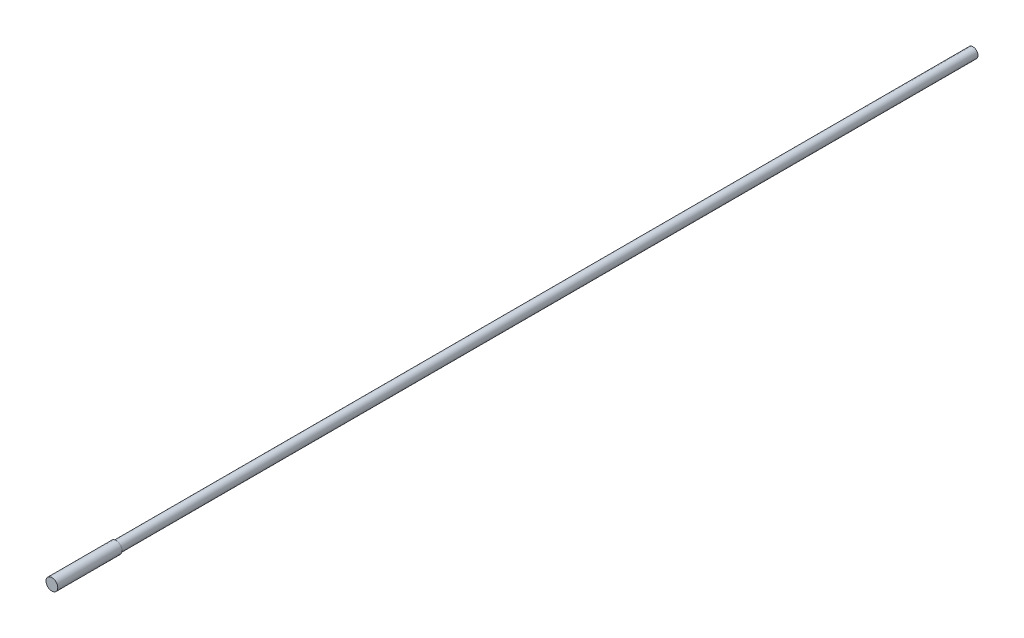
ISO-10303-21;
HEADER;
FILE_DESCRIPTION(('STEP AP214'),'2;1');
FILE_NAME('part.step','',(''),(''),'','','');
FILE_SCHEMA(('AUTOMOTIVE_DESIGN { 1 0 10303 214 1 1 1 1 }'));
ENDSEC;
DATA;
#1=APPLICATION_CONTEXT('core data for automotive mechanical design processes');
#2=APPLICATION_PROTOCOL_DEFINITION('international standard','automotive_design',2000,#1);
#3=PRODUCT_CONTEXT('',#1,'mechanical');
#4=PRODUCT('Part','Part','',(#3));
#5=PRODUCT_RELATED_PRODUCT_CATEGORY('part','',(#4));
#6=PRODUCT_DEFINITION_FORMATION('','',#4);
#7=PRODUCT_DEFINITION_CONTEXT('part definition',#1,'design');
#8=PRODUCT_DEFINITION('design','',#6,#7);
#9=PRODUCT_DEFINITION_SHAPE('','',#8);
#10=(LENGTH_UNIT() NAMED_UNIT(*) SI_UNIT(.MILLI.,.METRE.));
#11=(NAMED_UNIT(*) PLANE_ANGLE_UNIT() SI_UNIT($,.RADIAN.));
#12=(NAMED_UNIT(*) SI_UNIT($,.STERADIAN.) SOLID_ANGLE_UNIT());
#13=UNCERTAINTY_MEASURE_WITH_UNIT(LENGTH_MEASURE(1.E-05),#10,'distance_accuracy_value','');
#14=(GEOMETRIC_REPRESENTATION_CONTEXT(3) GLOBAL_UNCERTAINTY_ASSIGNED_CONTEXT((#13)) GLOBAL_UNIT_ASSIGNED_CONTEXT((#10,
#11,#12)) REPRESENTATION_CONTEXT('',''));
#15=CARTESIAN_POINT('',(0.,0.,0.));
#16=DIRECTION('',(0.,0.,1.));
#17=DIRECTION('',(1.,0.,0.));
#18=AXIS2_PLACEMENT_3D('',#15,#16,#17);
#19=CARTESIAN_POINT('',(0.,0.,0.));
#20=DIRECTION('',(0.,0.,1.));
#21=DIRECTION('',(1.,0.,0.));
#22=AXIS2_PLACEMENT_3D('',#19,#20,#21);
#23=PLANE('',#22);
#24=CARTESIAN_POINT('',(0.,0.,0.));
#25=DIRECTION('',(0.,0.,1.));
#26=DIRECTION('',(1.,0.,0.));
#27=AXIS2_PLACEMENT_3D('',#24,#25,#26);
#28=CIRCLE('',#27,2.3495);
#29=CARTESIAN_POINT('',(-2.3495,0.,0.));
#30=VERTEX_POINT('',#29);
#31=EDGE_CURVE('E35',#30,#30,#28,.T.);
#32=ORIENTED_EDGE('',*,*,#31,.F.);
#33=EDGE_LOOP('',(#32));
#34=FACE_BOUND('',#33,.T.);
#35=CARTESIAN_POINT('',(0.,0.,0.));
#36=DIRECTION('',(0.,0.,1.));
#37=DIRECTION('',(1.,0.,0.));
#38=AXIS2_PLACEMENT_3D('',#35,#36,#37);
#39=CIRCLE('',#38,1.5625);
#40=CARTESIAN_POINT('',(-1.5625,0.,0.));
#41=VERTEX_POINT('',#40);
#42=EDGE_CURVE('E42',#41,#41,#39,.T.);
#43=ORIENTED_EDGE('',*,*,#42,.T.);
#44=EDGE_LOOP('',(#43));
#45=FACE_BOUND('',#44,.T.);
#46=ADVANCED_FACE('F31',(#34,#45),#23,.F.);
#47=CARTESIAN_POINT('',(0.,0.,400.0000001));
#48=DIRECTION('',(0.,0.,-1.));
#49=DIRECTION('',(-1.,0.,0.));
#50=AXIS2_PLACEMENT_3D('',#47,#48,#49);
#51=CYLINDRICAL_SURFACE('',#50,2.3495);
#52=CARTESIAN_POINT('',(0.,0.,400.0000001));
#53=DIRECTION('',(0.,0.,1.));
#54=DIRECTION('',(1.,0.,0.));
#55=AXIS2_PLACEMENT_3D('',#52,#53,#54);
#56=CIRCLE('',#55,2.3495);
#57=CARTESIAN_POINT('',(-2.3495,0.,400.0000001));
#58=VERTEX_POINT('',#57);
#59=EDGE_CURVE('E10',#58,#58,#56,.T.);
#60=CARTESIAN_POINT('',(-2.3495,0.,400.0000001));
#61=CARTESIAN_POINT('',(-2.3495,0.,395.833333432292));
#62=CARTESIAN_POINT('',(-2.3495,0.,391.666666764583));
#63=CARTESIAN_POINT('',(-2.3495,0.,383.333333429167));
#64=CARTESIAN_POINT('',(-2.3495,0.,379.166666761458));
#65=CARTESIAN_POINT('',(-2.3495,0.,370.833333426042));
#66=CARTESIAN_POINT('',(-2.3495,0.,366.666666758333));
#67=CARTESIAN_POINT('',(-2.3495,0.,358.333333422917));
#68=CARTESIAN_POINT('',(-2.3495,0.,354.166666755208));
#69=CARTESIAN_POINT('',(-2.3495,0.,345.833333419792));
#70=CARTESIAN_POINT('',(-2.3495,0.,341.666666752083));
#71=CARTESIAN_POINT('',(-2.3495,0.,333.333333416667));
#72=CARTESIAN_POINT('',(-2.3495,0.,329.166666748958));
#73=CARTESIAN_POINT('',(-2.3495,0.,320.833333413542));
#74=CARTESIAN_POINT('',(-2.3495,0.,316.666666745833));
#75=CARTESIAN_POINT('',(-2.3495,0.,308.333333410417));
#76=CARTESIAN_POINT('',(-2.3495,0.,304.166666742708));
#77=CARTESIAN_POINT('',(-2.3495,0.,295.833333407292));
#78=CARTESIAN_POINT('',(-2.3495,0.,291.666666739583));
#79=CARTESIAN_POINT('',(-2.3495,0.,283.333333404167));
#80=CARTESIAN_POINT('',(-2.3495,0.,279.166666736458));
#81=CARTESIAN_POINT('',(-2.3495,0.,270.833333401042));
#82=CARTESIAN_POINT('',(-2.3495,0.,266.666666733333));
#83=CARTESIAN_POINT('',(-2.3495,0.,258.333333397917));
#84=CARTESIAN_POINT('',(-2.3495,0.,254.166666730208));
#85=CARTESIAN_POINT('',(-2.3495,0.,245.833333394792));
#86=CARTESIAN_POINT('',(-2.3495,0.,241.666666727083));
#87=CARTESIAN_POINT('',(-2.3495,0.,233.333333391667));
#88=CARTESIAN_POINT('',(-2.3495,0.,229.166666723958));
#89=CARTESIAN_POINT('',(-2.3495,0.,220.833333388542));
#90=CARTESIAN_POINT('',(-2.3495,0.,216.666666720833));
#91=CARTESIAN_POINT('',(-2.3495,0.,208.333333385417));
#92=CARTESIAN_POINT('',(-2.3495,0.,204.166666717708));
#93=CARTESIAN_POINT('',(-2.3495,0.,195.833333382292));
#94=CARTESIAN_POINT('',(-2.3495,0.,191.666666714583));
#95=CARTESIAN_POINT('',(-2.3495,0.,183.333333379167));
#96=CARTESIAN_POINT('',(-2.3495,0.,179.166666711458));
#97=CARTESIAN_POINT('',(-2.3495,0.,170.833333376042));
#98=CARTESIAN_POINT('',(-2.3495,0.,166.666666708333));
#99=CARTESIAN_POINT('',(-2.3495,0.,158.333333372917));
#100=CARTESIAN_POINT('',(-2.3495,0.,154.166666705208));
#101=CARTESIAN_POINT('',(-2.3495,0.,145.833333369792));
#102=CARTESIAN_POINT('',(-2.3495,0.,141.666666702083));
#103=CARTESIAN_POINT('',(-2.3495,0.,133.333333366667));
#104=CARTESIAN_POINT('',(-2.3495,0.,129.166666698958));
#105=CARTESIAN_POINT('',(-2.3495,0.,120.833333363542));
#106=CARTESIAN_POINT('',(-2.3495,0.,116.666666695833));
#107=CARTESIAN_POINT('',(-2.3495,0.,108.333333360417));
#108=CARTESIAN_POINT('',(-2.3495,0.,104.166666692708));
#109=CARTESIAN_POINT('',(-2.3495,0.,95.8333333572917));
#110=CARTESIAN_POINT('',(-2.3495,0.,91.6666666895833));
#111=CARTESIAN_POINT('',(-2.3495,0.,83.3333333541667));
#112=CARTESIAN_POINT('',(-2.3495,0.,79.1666666864583));
#113=CARTESIAN_POINT('',(-2.3495,0.,70.8333333510417));
#114=CARTESIAN_POINT('',(-2.3495,0.,66.6666666833333));
#115=CARTESIAN_POINT('',(-2.3495,0.,58.3333333479167));
#116=CARTESIAN_POINT('',(-2.3495,0.,54.1666666802083));
#117=CARTESIAN_POINT('',(-2.3495,0.,45.8333333447916));
#118=CARTESIAN_POINT('',(-2.3495,0.,41.6666666770833));
#119=CARTESIAN_POINT('',(-2.3495,0.,33.3333333416667));
#120=CARTESIAN_POINT('',(-2.3495,0.,29.1666666739583));
#121=CARTESIAN_POINT('',(-2.3495,0.,20.8333333385417));
#122=CARTESIAN_POINT('',(-2.3495,0.,16.6666666708334));
#123=CARTESIAN_POINT('',(-2.3495,0.,8.33333333541667));
#124=CARTESIAN_POINT('',(-2.3495,0.,4.16666666770834));
#125=CARTESIAN_POINT('',(-2.3495,0.,0.));
#126=B_SPLINE_CURVE_WITH_KNOTS('',3,(#60,#61,#62,#63,#64,#65,#66,#67,#68,#69,#70,#71,#72,#73,
#74,#75,#76,#77,#78,#79,#80,#81,#82,#83,#84,#85,#86,#87,#88,#89,#90,#91,#92,#93,#94,#95,#96,#97,
#98,#99,#100,#101,#102,#103,#104,#105,#106,#107,#108,#109,#110,#111,#112,#113,#114,#115,#116,
#117,#118,#119,#120,#121,#122,#123,#124,#125),.UNSPECIFIED.,.F.,.F.,(4,2,2,2,2,2,2,2,2,2,2,2,2,
2,2,2,2,2,2,2,2,2,2,2,2,2,2,2,2,2,2,2,4),(0.,12.500000003125,25.00000000625,37.500000009375,
50.0000000124999,62.5000000156249,75.00000001875,87.500000021875,100.000000025,112.500000028125,
125.00000003125,137.500000034375,150.0000000375,162.500000040625,175.00000004375,
187.500000046875,200.00000005,212.500000053125,225.00000005625,237.500000059375,250.0000000625,
262.500000065625,275.00000006875,287.500000071875,300.000000075,312.500000078125,
325.00000008125,337.500000084375,350.0000000875,362.500000090625,375.00000009375,
387.500000096875,400.0000001),.UNSPECIFIED.);
#127=EDGE_CURVE('BSEAM33',#58,#30,#126,.T.);
#128=ORIENTED_EDGE('',*,*,#59,.F.);
#129=ORIENTED_EDGE('',*,*,#31,.T.);
#130=ORIENTED_EDGE('',*,*,#127,.T.);
#131=ORIENTED_EDGE('',*,*,#127,.F.);
#132=EDGE_LOOP('',(#128,#130,#129,#131));
#133=FACE_BOUND('',#132,.T.);
#134=ADVANCED_FACE('F33',(#133),#51,.T.);
#135=CARTESIAN_POINT('',(0.,0.,400.0000001));
#136=DIRECTION('',(0.,0.,-1.));
#137=DIRECTION('',(-1.,0.,0.));
#138=AXIS2_PLACEMENT_3D('',#135,#136,#137);
#139=CYLINDRICAL_SURFACE('',#138,1.5625);
#140=CARTESIAN_POINT('',(0.,0.,400.0000001));
#141=DIRECTION('',(0.,0.,1.));
#142=DIRECTION('',(1.,0.,0.));
#143=AXIS2_PLACEMENT_3D('',#140,#141,#142);
#144=CIRCLE('',#143,1.5625);
#145=CARTESIAN_POINT('',(-1.5625,0.,400.0000001));
#146=VERTEX_POINT('',#145);
#147=EDGE_CURVE('E46',#146,#146,#144,.T.);
#148=CARTESIAN_POINT('',(-1.5625,0.,400.0000001));
#149=CARTESIAN_POINT('',(-1.5625,0.,395.833333432292));
#150=CARTESIAN_POINT('',(-1.5625,0.,391.666666764583));
#151=CARTESIAN_POINT('',(-1.5625,0.,383.333333429167));
#152=CARTESIAN_POINT('',(-1.5625,0.,379.166666761458));
#153=CARTESIAN_POINT('',(-1.5625,0.,370.833333426042));
#154=CARTESIAN_POINT('',(-1.5625,0.,366.666666758333));
#155=CARTESIAN_POINT('',(-1.5625,0.,358.333333422917));
#156=CARTESIAN_POINT('',(-1.5625,0.,354.166666755208));
#157=CARTESIAN_POINT('',(-1.5625,0.,345.833333419792));
#158=CARTESIAN_POINT('',(-1.5625,0.,341.666666752083));
#159=CARTESIAN_POINT('',(-1.5625,0.,333.333333416667));
#160=CARTESIAN_POINT('',(-1.5625,0.,329.166666748958));
#161=CARTESIAN_POINT('',(-1.5625,0.,320.833333413542));
#162=CARTESIAN_POINT('',(-1.5625,0.,316.666666745833));
#163=CARTESIAN_POINT('',(-1.5625,0.,308.333333410417));
#164=CARTESIAN_POINT('',(-1.5625,0.,304.166666742708));
#165=CARTESIAN_POINT('',(-1.5625,0.,295.833333407292));
#166=CARTESIAN_POINT('',(-1.5625,0.,291.666666739583));
#167=CARTESIAN_POINT('',(-1.5625,0.,283.333333404167));
#168=CARTESIAN_POINT('',(-1.5625,0.,279.166666736458));
#169=CARTESIAN_POINT('',(-1.5625,0.,270.833333401042));
#170=CARTESIAN_POINT('',(-1.5625,0.,266.666666733333));
#171=CARTESIAN_POINT('',(-1.5625,0.,258.333333397917));
#172=CARTESIAN_POINT('',(-1.5625,0.,254.166666730208));
#173=CARTESIAN_POINT('',(-1.5625,0.,245.833333394792));
#174=CARTESIAN_POINT('',(-1.5625,0.,241.666666727083));
#175=CARTESIAN_POINT('',(-1.5625,0.,233.333333391667));
#176=CARTESIAN_POINT('',(-1.5625,0.,229.166666723958));
#177=CARTESIAN_POINT('',(-1.5625,0.,220.833333388542));
#178=CARTESIAN_POINT('',(-1.5625,0.,216.666666720833));
#179=CARTESIAN_POINT('',(-1.5625,0.,208.333333385417));
#180=CARTESIAN_POINT('',(-1.5625,0.,204.166666717708));
#181=CARTESIAN_POINT('',(-1.5625,0.,195.833333382292));
#182=CARTESIAN_POINT('',(-1.5625,0.,191.666666714583));
#183=CARTESIAN_POINT('',(-1.5625,0.,183.333333379167));
#184=CARTESIAN_POINT('',(-1.5625,0.,179.166666711458));
#185=CARTESIAN_POINT('',(-1.5625,0.,170.833333376042));
#186=CARTESIAN_POINT('',(-1.5625,0.,166.666666708333));
#187=CARTESIAN_POINT('',(-1.5625,0.,158.333333372917));
#188=CARTESIAN_POINT('',(-1.5625,0.,154.166666705208));
#189=CARTESIAN_POINT('',(-1.5625,0.,145.833333369792));
#190=CARTESIAN_POINT('',(-1.5625,0.,141.666666702083));
#191=CARTESIAN_POINT('',(-1.5625,0.,133.333333366667));
#192=CARTESIAN_POINT('',(-1.5625,0.,129.166666698958));
#193=CARTESIAN_POINT('',(-1.5625,0.,120.833333363542));
#194=CARTESIAN_POINT('',(-1.5625,0.,116.666666695833));
#195=CARTESIAN_POINT('',(-1.5625,0.,108.333333360417));
#196=CARTESIAN_POINT('',(-1.5625,0.,104.166666692708));
#197=CARTESIAN_POINT('',(-1.5625,0.,95.8333333572917));
#198=CARTESIAN_POINT('',(-1.5625,0.,91.6666666895833));
#199=CARTESIAN_POINT('',(-1.5625,0.,83.3333333541667));
#200=CARTESIAN_POINT('',(-1.5625,0.,79.1666666864583));
#201=CARTESIAN_POINT('',(-1.5625,0.,70.8333333510417));
#202=CARTESIAN_POINT('',(-1.5625,0.,66.6666666833333));
#203=CARTESIAN_POINT('',(-1.5625,0.,58.3333333479167));
#204=CARTESIAN_POINT('',(-1.5625,0.,54.1666666802083));
#205=CARTESIAN_POINT('',(-1.5625,0.,45.8333333447916));
#206=CARTESIAN_POINT('',(-1.5625,0.,41.6666666770833));
#207=CARTESIAN_POINT('',(-1.5625,0.,33.3333333416667));
#208=CARTESIAN_POINT('',(-1.5625,0.,29.1666666739583));
#209=CARTESIAN_POINT('',(-1.5625,0.,20.8333333385417));
#210=CARTESIAN_POINT('',(-1.5625,0.,16.6666666708334));
#211=CARTESIAN_POINT('',(-1.5625,0.,8.33333333541667));
#212=CARTESIAN_POINT('',(-1.5625,0.,4.16666666770834));
#213=CARTESIAN_POINT('',(-1.5625,0.,0.));
#214=B_SPLINE_CURVE_WITH_KNOTS('',3,(#148,#149,#150,#151,#152,#153,#154,#155,#156,#157,#158,
#159,#160,#161,#162,#163,#164,#165,#166,#167,#168,#169,#170,#171,#172,#173,#174,#175,#176,#177,
#178,#179,#180,#181,#182,#183,#184,#185,#186,#187,#188,#189,#190,#191,#192,#193,#194,#195,#196,
#197,#198,#199,#200,#201,#202,#203,#204,#205,#206,#207,#208,#209,#210,#211,#212,#213),
.UNSPECIFIED.,.F.,.F.,(4,2,2,2,2,2,2,2,2,2,2,2,2,2,2,2,2,2,2,2,2,2,2,2,2,2,2,2,2,2,2,2,4),(0.,
12.500000003125,25.00000000625,37.500000009375,50.0000000125,62.500000015625,75.00000001875,
87.500000021875,100.000000025,112.500000028125,125.00000003125,137.500000034375,150.0000000375,
162.500000040625,175.00000004375,187.500000046875,200.00000005,212.500000053125,225.00000005625,
237.500000059375,250.0000000625,262.500000065625,275.00000006875,287.500000071875,300.000000075,
312.500000078125,325.00000008125,337.500000084375,350.0000000875,362.500000090625,
375.00000009375,387.500000096875,400.0000001),.UNSPECIFIED.);
#215=EDGE_CURVE('BSEAM71',#146,#41,#214,.T.);
#216=ORIENTED_EDGE('',*,*,#147,.T.);
#217=ORIENTED_EDGE('',*,*,#42,.F.);
#218=ORIENTED_EDGE('',*,*,#215,.T.);
#219=ORIENTED_EDGE('',*,*,#215,.F.);
#220=EDGE_LOOP('',(#216,#218,#217,#219));
#221=FACE_BOUND('',#220,.T.);
#222=ADVANCED_FACE('F71',(#221),#139,.F.);
#223=CARTESIAN_POINT('',(0.,0.,400.0000001));
#224=DIRECTION('',(0.,0.,1.));
#225=DIRECTION('',(1.,0.,0.));
#226=AXIS2_PLACEMENT_3D('',#223,#224,#225);
#227=PLANE('',#226);
#228=ORIENTED_EDGE('',*,*,#147,.F.);
#229=EDGE_LOOP('',(#228));
#230=FACE_BOUND('',#229,.T.);
#231=ADVANCED_FACE('F66',(#230),#227,.F.);
#232=CARTESIAN_POINT('',(0.,0.,400.0000001));
#233=DIRECTION('',(0.,0.,1.));
#234=DIRECTION('',(1.,0.,0.));
#235=AXIS2_PLACEMENT_3D('',#232,#233,#234);
#236=CIRCLE('',#235,2.75);
#237=CARTESIAN_POINT('',(2.75,0.,400.0000001));
#238=VERTEX_POINT('',#237);
#239=EDGE_CURVE('E50',#238,#238,#236,.T.);
#240=ORIENTED_EDGE('',*,*,#239,.F.);
#241=EDGE_LOOP('',(#240));
#242=FACE_BOUND('',#241,.T.);
#243=ORIENTED_EDGE('',*,*,#59,.T.);
#244=EDGE_LOOP('',(#243));
#245=FACE_BOUND('',#244,.T.);
#246=ADVANCED_FACE('F61',(#242,#245),#227,.F.);
#247=CARTESIAN_POINT('',(0.,0.,430.0000001));
#248=DIRECTION('',(0.,0.,-1.));
#249=DIRECTION('',(-1.,0.,0.));
#250=AXIS2_PLACEMENT_3D('',#247,#248,#249);
#251=CYLINDRICAL_SURFACE('',#250,2.75);
#252=CARTESIAN_POINT('',(0.,0.,430.0000001));
#253=DIRECTION('',(0.,0.,1.));
#254=DIRECTION('',(1.,0.,0.));
#255=AXIS2_PLACEMENT_3D('',#252,#253,#254);
#256=CIRCLE('',#255,2.75);
#257=CARTESIAN_POINT('',(2.75,0.,430.0000001));
#258=VERTEX_POINT('',#257);
#259=EDGE_CURVE('E49',#258,#258,#256,.T.);
#260=ORIENTED_EDGE('',*,*,#259,.F.);
#261=EDGE_LOOP('',(#260));
#262=FACE_BOUND('',#261,.T.);
#263=ORIENTED_EDGE('',*,*,#239,.T.);
#264=EDGE_LOOP('',(#263));
#265=FACE_BOUND('',#264,.T.);
#266=ADVANCED_FACE('F58',(#262,#265),#251,.T.);
#267=CARTESIAN_POINT('',(0.,0.,430.0000001));
#268=DIRECTION('',(0.,0.,1.));
#269=DIRECTION('',(1.,0.,0.));
#270=AXIS2_PLACEMENT_3D('',#267,#268,#269);
#271=PLANE('',#270);
#272=ORIENTED_EDGE('',*,*,#259,.T.);
#273=EDGE_LOOP('',(#272));
#274=FACE_BOUND('',#273,.T.);
#275=ADVANCED_FACE('F56',(#274),#271,.T.);
#276=CLOSED_SHELL('',(#46,#134,#222,#231,#246,#266,#275));
#277=MANIFOLD_SOLID_BREP('B2',#276);
#278=ADVANCED_BREP_SHAPE_REPRESENTATION('',(#18,#277),#14);
#279=SHAPE_DEFINITION_REPRESENTATION(#9,#278);
ENDSEC;
END-ISO-10303-21;
